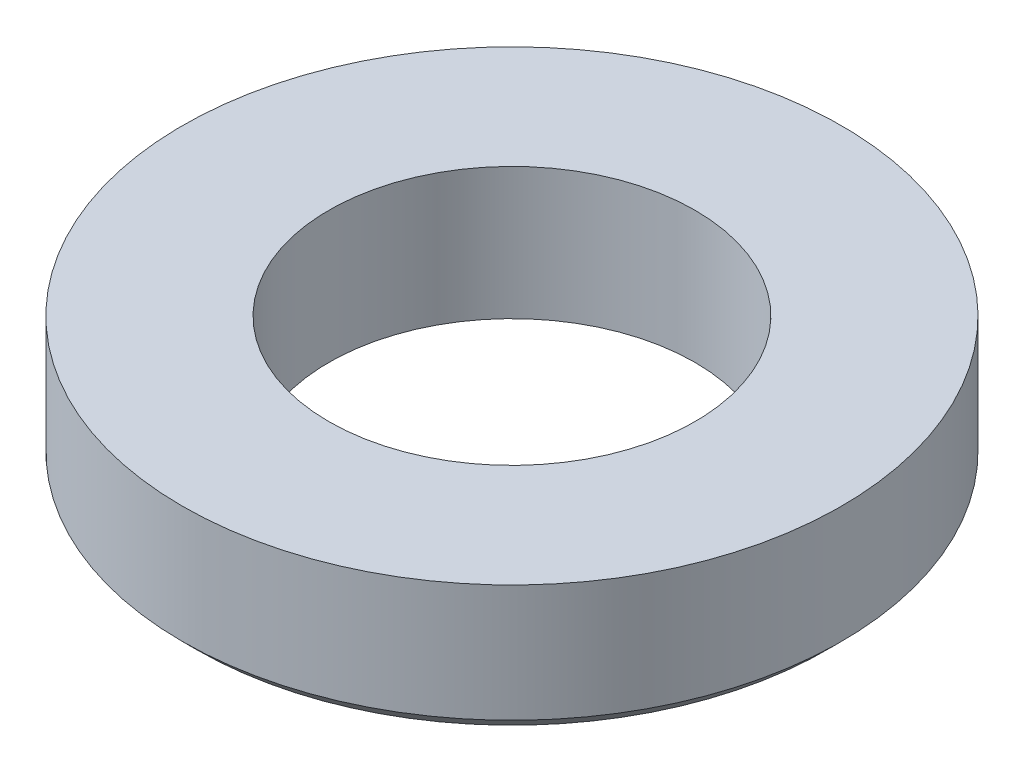
ISO-10303-21;
HEADER;
FILE_DESCRIPTION(('STEP AP214'),'2;1');
FILE_NAME('part.step','',(''),(''),'','','');
FILE_SCHEMA(('AUTOMOTIVE_DESIGN { 1 0 10303 214 1 1 1 1 }'));
ENDSEC;
DATA;
#1=APPLICATION_CONTEXT('core data for automotive mechanical design processes');
#2=APPLICATION_PROTOCOL_DEFINITION('international standard','automotive_design',2000,#1);
#3=PRODUCT_CONTEXT('',#1,'mechanical');
#4=PRODUCT('Part','Part','',(#3));
#5=PRODUCT_RELATED_PRODUCT_CATEGORY('part','',(#4));
#6=PRODUCT_DEFINITION_FORMATION('','',#4);
#7=PRODUCT_DEFINITION_CONTEXT('part definition',#1,'design');
#8=PRODUCT_DEFINITION('design','',#6,#7);
#9=PRODUCT_DEFINITION_SHAPE('','',#8);
#10=(LENGTH_UNIT() NAMED_UNIT(*) SI_UNIT(.MILLI.,.METRE.));
#11=(NAMED_UNIT(*) PLANE_ANGLE_UNIT() SI_UNIT($,.RADIAN.));
#12=(NAMED_UNIT(*) SI_UNIT($,.STERADIAN.) SOLID_ANGLE_UNIT());
#13=UNCERTAINTY_MEASURE_WITH_UNIT(LENGTH_MEASURE(1.E-05),#10,'distance_accuracy_value','');
#14=(GEOMETRIC_REPRESENTATION_CONTEXT(3) GLOBAL_UNCERTAINTY_ASSIGNED_CONTEXT((#13)) GLOBAL_UNIT_ASSIGNED_CONTEXT((#10,
#11,#12)) REPRESENTATION_CONTEXT('',''));
#15=CARTESIAN_POINT('',(0.,0.,0.));
#16=DIRECTION('',(0.,0.,1.));
#17=DIRECTION('',(1.,0.,0.));
#18=AXIS2_PLACEMENT_3D('',#15,#16,#17);
#19=CARTESIAN_POINT('',(0.,0.200000561278557,0.));
#20=DIRECTION('',(0.,1.,0.));
#21=DIRECTION('',(0.,0.,1.));
#22=AXIS2_PLACEMENT_3D('',#19,#20,#21);
#23=CONICAL_SURFACE('',#22,4.49999980065741,0.785398078843012);
#24=CARTESIAN_POINT('',(0.,0.200000362059,0.));
#25=DIRECTION('',(0.,1.,0.));
#26=DIRECTION('',(0.,0.,1.));
#27=AXIS2_PLACEMENT_3D('',#24,#25,#26);
#28=CIRCLE('',#27,4.5);
#29=CARTESIAN_POINT('',(0.,0.200000362059,4.5));
#30=VERTEX_POINT('',#29);
#31=EDGE_CURVE('E29',#30,#30,#28,.T.);
#32=ORIENTED_EDGE('',*,*,#31,.F.);
#33=EDGE_LOOP('',(#32));
#34=FACE_BOUND('',#33,.T.);
#35=CARTESIAN_POINT('',(0.,1.91960225492949E-07,0.));
#36=DIRECTION('',(0.,1.,0.));
#37=DIRECTION('',(0.,0.,1.));
#38=AXIS2_PLACEMENT_3D('',#35,#36,#37);
#39=CIRCLE('',#38,4.29999946516091);
#40=CARTESIAN_POINT('',(0.,1.91960225492949E-07,4.29999946516091));
#41=VERTEX_POINT('',#40);
#42=EDGE_CURVE('E17',#41,#41,#39,.T.);
#43=ORIENTED_EDGE('',*,*,#42,.T.);
#44=EDGE_LOOP('',(#43));
#45=FACE_BOUND('',#44,.T.);
#46=ADVANCED_FACE('F14',(#34,#45),#23,.T.);
#47=CARTESIAN_POINT('',(0.,0.,0.));
#48=DIRECTION('',(0.,1.,0.));
#49=DIRECTION('',(0.,0.,1.));
#50=AXIS2_PLACEMENT_3D('',#47,#48,#49);
#51=PLANE('',#50);
#52=CARTESIAN_POINT('',(0.,0.,0.));
#53=DIRECTION('',(0.,1.,0.));
#54=DIRECTION('',(0.,0.,1.));
#55=AXIS2_PLACEMENT_3D('',#52,#53,#54);
#56=CIRCLE('',#55,2.5);
#57=CARTESIAN_POINT('',(0.,0.,2.5));
#58=VERTEX_POINT('',#57);
#59=EDGE_CURVE('E26',#58,#58,#56,.T.);
#60=ORIENTED_EDGE('',*,*,#59,.T.);
#61=EDGE_LOOP('',(#60));
#62=FACE_BOUND('',#61,.T.);
#63=ORIENTED_EDGE('',*,*,#42,.F.);
#64=EDGE_LOOP('',(#63));
#65=FACE_BOUND('',#64,.T.);
#66=ADVANCED_FACE('F40',(#62,#65),#51,.F.);
#67=CARTESIAN_POINT('',(0.,0.,0.));
#68=DIRECTION('',(0.,1.,0.));
#69=DIRECTION('',(0.,0.,1.));
#70=AXIS2_PLACEMENT_3D('',#67,#68,#69);
#71=CYLINDRICAL_SURFACE('',#70,4.5);
#72=CARTESIAN_POINT('',(0.,1.8,0.));
#73=DIRECTION('',(0.,1.,0.));
#74=DIRECTION('',(0.,0.,1.));
#75=AXIS2_PLACEMENT_3D('',#72,#73,#74);
#76=CIRCLE('',#75,4.5);
#77=CARTESIAN_POINT('',(0.,1.8,4.5));
#78=VERTEX_POINT('',#77);
#79=EDGE_CURVE('E21',#78,#78,#76,.T.);
#80=ORIENTED_EDGE('',*,*,#79,.F.);
#81=EDGE_LOOP('',(#80));
#82=FACE_BOUND('',#81,.T.);
#83=ORIENTED_EDGE('',*,*,#31,.T.);
#84=EDGE_LOOP('',(#83));
#85=FACE_BOUND('',#84,.T.);
#86=ADVANCED_FACE('F42',(#82,#85),#71,.T.);
#87=CARTESIAN_POINT('',(0.,0.,0.));
#88=DIRECTION('',(0.,1.,0.));
#89=DIRECTION('',(0.,0.,1.));
#90=AXIS2_PLACEMENT_3D('',#87,#88,#89);
#91=CYLINDRICAL_SURFACE('',#90,2.5);
#92=CARTESIAN_POINT('',(0.,1.8,0.));
#93=DIRECTION('',(0.,1.,0.));
#94=DIRECTION('',(0.,0.,1.));
#95=AXIS2_PLACEMENT_3D('',#92,#93,#94);
#96=CIRCLE('',#95,2.5);
#97=CARTESIAN_POINT('',(0.,1.8,2.5));
#98=VERTEX_POINT('',#97);
#99=EDGE_CURVE('E9',#98,#98,#96,.F.);
#100=ORIENTED_EDGE('',*,*,#99,.F.);
#101=EDGE_LOOP('',(#100));
#102=FACE_BOUND('',#101,.T.);
#103=ORIENTED_EDGE('',*,*,#59,.F.);
#104=EDGE_LOOP('',(#103));
#105=FACE_BOUND('',#104,.T.);
#106=ADVANCED_FACE('F48',(#102,#105),#91,.F.);
#107=CARTESIAN_POINT('',(0.,1.8,0.));
#108=DIRECTION('',(0.,1.,0.));
#109=DIRECTION('',(0.,0.,1.));
#110=AXIS2_PLACEMENT_3D('',#107,#108,#109);
#111=PLANE('',#110);
#112=ORIENTED_EDGE('',*,*,#99,.T.);
#113=EDGE_LOOP('',(#112));
#114=FACE_BOUND('',#113,.T.);
#115=ORIENTED_EDGE('',*,*,#79,.T.);
#116=EDGE_LOOP('',(#115));
#117=FACE_BOUND('',#116,.T.);
#118=ADVANCED_FACE('F52',(#114,#117),#111,.T.);
#119=CLOSED_SHELL('',(#46,#66,#86,#106,#118));
#120=MANIFOLD_SOLID_BREP('B1',#119);
#121=ADVANCED_BREP_SHAPE_REPRESENTATION('',(#18,#120),#14);
#122=SHAPE_DEFINITION_REPRESENTATION(#9,#121);
ENDSEC;
END-ISO-10303-21;
